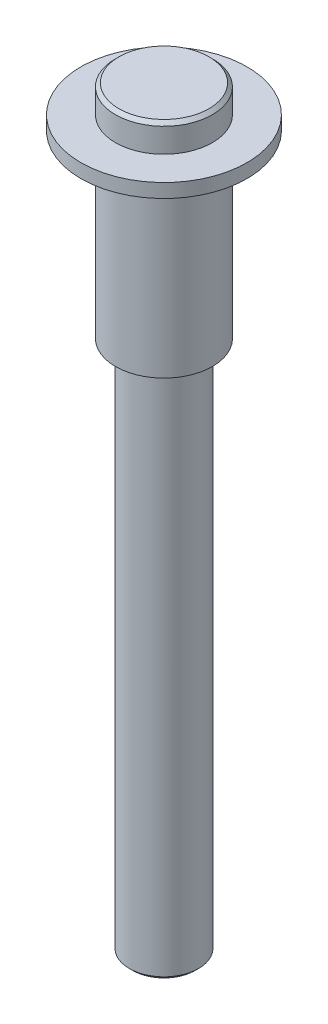
ISO-10303-21;
HEADER;
FILE_DESCRIPTION(('STEP AP214'),'2;1');
FILE_NAME('part.step','',(''),(''),'','','');
FILE_SCHEMA(('AUTOMOTIVE_DESIGN { 1 0 10303 214 1 1 1 1 }'));
ENDSEC;
DATA;
#1=APPLICATION_CONTEXT('core data for automotive mechanical design processes');
#2=APPLICATION_PROTOCOL_DEFINITION('international standard','automotive_design',2000,#1);
#3=PRODUCT_CONTEXT('',#1,'mechanical');
#4=PRODUCT('Part','Part','',(#3));
#5=PRODUCT_RELATED_PRODUCT_CATEGORY('part','',(#4));
#6=PRODUCT_DEFINITION_FORMATION('','',#4);
#7=PRODUCT_DEFINITION_CONTEXT('part definition',#1,'design');
#8=PRODUCT_DEFINITION('design','',#6,#7);
#9=PRODUCT_DEFINITION_SHAPE('','',#8);
#10=(LENGTH_UNIT() NAMED_UNIT(*) SI_UNIT(.MILLI.,.METRE.));
#11=(NAMED_UNIT(*) PLANE_ANGLE_UNIT() SI_UNIT($,.RADIAN.));
#12=(NAMED_UNIT(*) SI_UNIT($,.STERADIAN.) SOLID_ANGLE_UNIT());
#13=UNCERTAINTY_MEASURE_WITH_UNIT(LENGTH_MEASURE(1.E-05),#10,'distance_accuracy_value','');
#14=(GEOMETRIC_REPRESENTATION_CONTEXT(3) GLOBAL_UNCERTAINTY_ASSIGNED_CONTEXT((#13)) GLOBAL_UNIT_ASSIGNED_CONTEXT((#10,
#11,#12)) REPRESENTATION_CONTEXT('',''));
#15=CARTESIAN_POINT('',(0.,0.,0.));
#16=DIRECTION('',(0.,0.,1.));
#17=DIRECTION('',(1.,0.,0.));
#18=AXIS2_PLACEMENT_3D('',#15,#16,#17);
#19=CARTESIAN_POINT('',(0.,16.,0.));
#20=DIRECTION('',(0.,-1.,0.));
#21=DIRECTION('',(0.,0.,-1.));
#22=AXIS2_PLACEMENT_3D('',#19,#20,#21);
#23=CYLINDRICAL_SURFACE('',#22,3.5);
#24=CARTESIAN_POINT('',(0.,0.,0.));
#25=DIRECTION('',(0.,1.,0.));
#26=DIRECTION('',(0.,0.,1.));
#27=AXIS2_PLACEMENT_3D('',#24,#25,#26);
#28=CIRCLE('',#27,3.5);
#29=CARTESIAN_POINT('',(0.,0.,3.5));
#30=VERTEX_POINT('',#29);
#31=EDGE_CURVE('E53',#30,#30,#28,.T.);
#32=ORIENTED_EDGE('',*,*,#31,.T.);
#33=EDGE_LOOP('',(#32));
#34=FACE_BOUND('',#33,.T.);
#35=CARTESIAN_POINT('',(0.,13.,0.));
#36=DIRECTION('',(0.,1.,0.));
#37=DIRECTION('',(0.,0.,1.));
#38=AXIS2_PLACEMENT_3D('',#35,#36,#37);
#39=CIRCLE('',#38,3.5);
#40=CARTESIAN_POINT('',(0.,13.,3.5));
#41=VERTEX_POINT('',#40);
#42=EDGE_CURVE('E10',#41,#41,#39,.T.);
#43=ORIENTED_EDGE('',*,*,#42,.F.);
#44=EDGE_LOOP('',(#43));
#45=FACE_BOUND('',#44,.T.);
#46=ADVANCED_FACE('F32',(#34,#45),#23,.T.);
#47=CARTESIAN_POINT('',(0.,0.,0.));
#48=DIRECTION('',(0.,1.,0.));
#49=DIRECTION('',(0.,0.,1.));
#50=AXIS2_PLACEMENT_3D('',#47,#48,#49);
#51=PLANE('',#50);
#52=CARTESIAN_POINT('',(0.,0.,0.));
#53=DIRECTION('',(0.,1.,0.));
#54=DIRECTION('',(0.,0.,1.));
#55=AXIS2_PLACEMENT_3D('',#52,#53,#54);
#56=CIRCLE('',#55,2.5);
#57=CARTESIAN_POINT('',(0.,0.,2.5));
#58=VERTEX_POINT('',#57);
#59=EDGE_CURVE('E48',#58,#58,#56,.F.);
#60=ORIENTED_EDGE('',*,*,#59,.F.);
#61=EDGE_LOOP('',(#60));
#62=FACE_BOUND('',#61,.T.);
#63=ORIENTED_EDGE('',*,*,#31,.F.);
#64=EDGE_LOOP('',(#63));
#65=FACE_BOUND('',#64,.T.);
#66=ADVANCED_FACE('F77',(#62,#65),#51,.F.);
#67=CARTESIAN_POINT('',(0.,-38.4,0.));
#68=DIRECTION('',(0.,1.,0.));
#69=DIRECTION('',(0.,0.,1.));
#70=AXIS2_PLACEMENT_3D('',#67,#68,#69);
#71=CYLINDRICAL_SURFACE('',#70,2.5);
#72=CARTESIAN_POINT('',(0.,-38.15,0.));
#73=DIRECTION('',(0.,-1.,0.));
#74=DIRECTION('',(0.,0.,-1.));
#75=AXIS2_PLACEMENT_3D('',#72,#73,#74);
#76=CIRCLE('',#75,2.5);
#77=CARTESIAN_POINT('',(0.,-38.15,-2.5));
#78=VERTEX_POINT('',#77);
#79=EDGE_CURVE('E39',#78,#78,#76,.F.);
#80=ORIENTED_EDGE('',*,*,#79,.T.);
#81=EDGE_LOOP('',(#80));
#82=FACE_BOUND('',#81,.T.);
#83=ORIENTED_EDGE('',*,*,#59,.T.);
#84=EDGE_LOOP('',(#83));
#85=FACE_BOUND('',#84,.T.);
#86=ADVANCED_FACE('F75',(#82,#85),#71,.T.);
#87=CARTESIAN_POINT('',(0.,-38.4,0.));
#88=DIRECTION('',(0.,-1.,0.));
#89=DIRECTION('',(0.,0.,-1.));
#90=AXIS2_PLACEMENT_3D('',#87,#88,#89);
#91=PLANE('',#90);
#92=CARTESIAN_POINT('',(0.,-38.4,0.));
#93=DIRECTION('',(0.,-1.,0.));
#94=DIRECTION('',(0.,0.,-1.));
#95=AXIS2_PLACEMENT_3D('',#92,#93,#94);
#96=CIRCLE('',#95,2.25);
#97=CARTESIAN_POINT('',(0.,-38.4,-2.25));
#98=VERTEX_POINT('',#97);
#99=EDGE_CURVE('E43',#98,#98,#96,.T.);
#100=ORIENTED_EDGE('',*,*,#99,.T.);
#101=EDGE_LOOP('',(#100));
#102=FACE_BOUND('',#101,.T.);
#103=ADVANCED_FACE('F113',(#102),#91,.T.);
#104=CARTESIAN_POINT('',(0.,-38.4,0.));
#105=DIRECTION('',(0.,1.,0.));
#106=DIRECTION('',(0.,0.,1.));
#107=AXIS2_PLACEMENT_3D('',#104,#105,#106);
#108=CONICAL_SURFACE('',#107,2.25,0.785398163397444);
#109=ORIENTED_EDGE('',*,*,#79,.F.);
#110=EDGE_LOOP('',(#109));
#111=FACE_BOUND('',#110,.T.);
#112=ORIENTED_EDGE('',*,*,#99,.F.);
#113=EDGE_LOOP('',(#112));
#114=FACE_BOUND('',#113,.T.);
#115=ADVANCED_FACE('F34',(#111,#114),#108,.T.);
#116=CARTESIAN_POINT('',(0.,13.,0.));
#117=DIRECTION('',(0.,1.,0.));
#118=DIRECTION('',(0.,0.,1.));
#119=AXIS2_PLACEMENT_3D('',#116,#117,#118);
#120=CYLINDRICAL_SURFACE('',#119,6.);
#121=CARTESIAN_POINT('',(0.,13.,0.));
#122=DIRECTION('',(0.,1.,0.));
#123=DIRECTION('',(0.,0.,1.));
#124=AXIS2_PLACEMENT_3D('',#121,#122,#123);
#125=CIRCLE('',#124,6.);
#126=CARTESIAN_POINT('',(0.,13.,6.));
#127=VERTEX_POINT('',#126);
#128=EDGE_CURVE('E54',#127,#127,#125,.T.);
#129=ORIENTED_EDGE('',*,*,#128,.T.);
#130=EDGE_LOOP('',(#129));
#131=FACE_BOUND('',#130,.T.);
#132=CARTESIAN_POINT('',(0.,14.,0.));
#133=DIRECTION('',(0.,1.,0.));
#134=DIRECTION('',(0.,0.,1.));
#135=AXIS2_PLACEMENT_3D('',#132,#133,#134);
#136=CIRCLE('',#135,6.);
#137=CARTESIAN_POINT('',(0.,14.,6.));
#138=VERTEX_POINT('',#137);
#139=EDGE_CURVE('E61',#138,#138,#136,.T.);
#140=ORIENTED_EDGE('',*,*,#139,.F.);
#141=EDGE_LOOP('',(#140));
#142=FACE_BOUND('',#141,.T.);
#143=ADVANCED_FACE('F117',(#131,#142),#120,.T.);
#144=CARTESIAN_POINT('',(0.,13.,0.));
#145=DIRECTION('',(0.,1.,0.));
#146=DIRECTION('',(0.,0.,1.));
#147=AXIS2_PLACEMENT_3D('',#144,#145,#146);
#148=PLANE('',#147);
#149=ORIENTED_EDGE('',*,*,#42,.T.);
#150=EDGE_LOOP('',(#149));
#151=FACE_BOUND('',#150,.T.);
#152=ORIENTED_EDGE('',*,*,#128,.F.);
#153=EDGE_LOOP('',(#152));
#154=FACE_BOUND('',#153,.T.);
#155=ADVANCED_FACE('F107',(#151,#154),#148,.F.);
#156=CARTESIAN_POINT('',(0.,14.,0.));
#157=DIRECTION('',(0.,1.,0.));
#158=DIRECTION('',(0.,0.,1.));
#159=AXIS2_PLACEMENT_3D('',#156,#157,#158);
#160=PLANE('',#159);
#161=CARTESIAN_POINT('',(0.,14.,0.));
#162=DIRECTION('',(0.,1.,0.));
#163=DIRECTION('',(0.,0.,1.));
#164=AXIS2_PLACEMENT_3D('',#161,#162,#163);
#165=CIRCLE('',#164,3.5);
#166=CARTESIAN_POINT('',(0.,14.,3.5));
#167=VERTEX_POINT('',#166);
#168=EDGE_CURVE('E51',#167,#167,#165,.T.);
#169=ORIENTED_EDGE('',*,*,#168,.F.);
#170=EDGE_LOOP('',(#169));
#171=FACE_BOUND('',#170,.T.);
#172=ORIENTED_EDGE('',*,*,#139,.T.);
#173=EDGE_LOOP('',(#172));
#174=FACE_BOUND('',#173,.T.);
#175=ADVANCED_FACE('F102',(#171,#174),#160,.T.);
#176=CARTESIAN_POINT('',(0.,16.,0.));
#177=DIRECTION('',(0.,1.,0.));
#178=DIRECTION('',(0.,0.,1.));
#179=AXIS2_PLACEMENT_3D('',#176,#177,#178);
#180=PLANE('',#179);
#181=CARTESIAN_POINT('',(0.,16.,0.));
#182=DIRECTION('',(0.,1.,0.));
#183=DIRECTION('',(0.,0.,1.));
#184=AXIS2_PLACEMENT_3D('',#181,#182,#183);
#185=CIRCLE('',#184,3.25);
#186=CARTESIAN_POINT('',(0.,16.,3.25));
#187=VERTEX_POINT('',#186);
#188=EDGE_CURVE('E58',#187,#187,#185,.T.);
#189=ORIENTED_EDGE('',*,*,#188,.T.);
#190=EDGE_LOOP('',(#189));
#191=FACE_BOUND('',#190,.T.);
#192=ADVANCED_FACE('F94',(#191),#180,.T.);
#193=CARTESIAN_POINT('',(0.,16.,0.));
#194=DIRECTION('',(0.,-1.,0.));
#195=DIRECTION('',(0.,0.,-1.));
#196=AXIS2_PLACEMENT_3D('',#193,#194,#195);
#197=CONICAL_SURFACE('',#196,3.25,0.785398163397441);
#198=CARTESIAN_POINT('',(0.,15.75,0.));
#199=DIRECTION('',(0.,1.,0.));
#200=DIRECTION('',(0.,0.,1.));
#201=AXIS2_PLACEMENT_3D('',#198,#199,#200);
#202=CIRCLE('',#201,3.5);
#203=CARTESIAN_POINT('',(0.,15.75,3.5));
#204=VERTEX_POINT('',#203);
#205=EDGE_CURVE('E70',#204,#204,#202,.F.);
#206=ORIENTED_EDGE('',*,*,#205,.F.);
#207=EDGE_LOOP('',(#206));
#208=FACE_BOUND('',#207,.T.);
#209=ORIENTED_EDGE('',*,*,#188,.F.);
#210=EDGE_LOOP('',(#209));
#211=FACE_BOUND('',#210,.T.);
#212=ADVANCED_FACE('F90',(#208,#211),#197,.T.);
#213=ORIENTED_EDGE('',*,*,#168,.T.);
#214=EDGE_LOOP('',(#213));
#215=FACE_BOUND('',#214,.T.);
#216=ORIENTED_EDGE('',*,*,#205,.T.);
#217=EDGE_LOOP('',(#216));
#218=FACE_BOUND('',#217,.T.);
#219=ADVANCED_FACE('F86',(#215,#218),#23,.T.);
#220=CLOSED_SHELL('',(#46,#66,#86,#103,#115,#143,#155,#175,#192,#212,#219));
#221=MANIFOLD_SOLID_BREP('B2',#220);
#222=ADVANCED_BREP_SHAPE_REPRESENTATION('',(#18,#221),#14);
#223=SHAPE_DEFINITION_REPRESENTATION(#9,#222);
ENDSEC;
END-ISO-10303-21;
